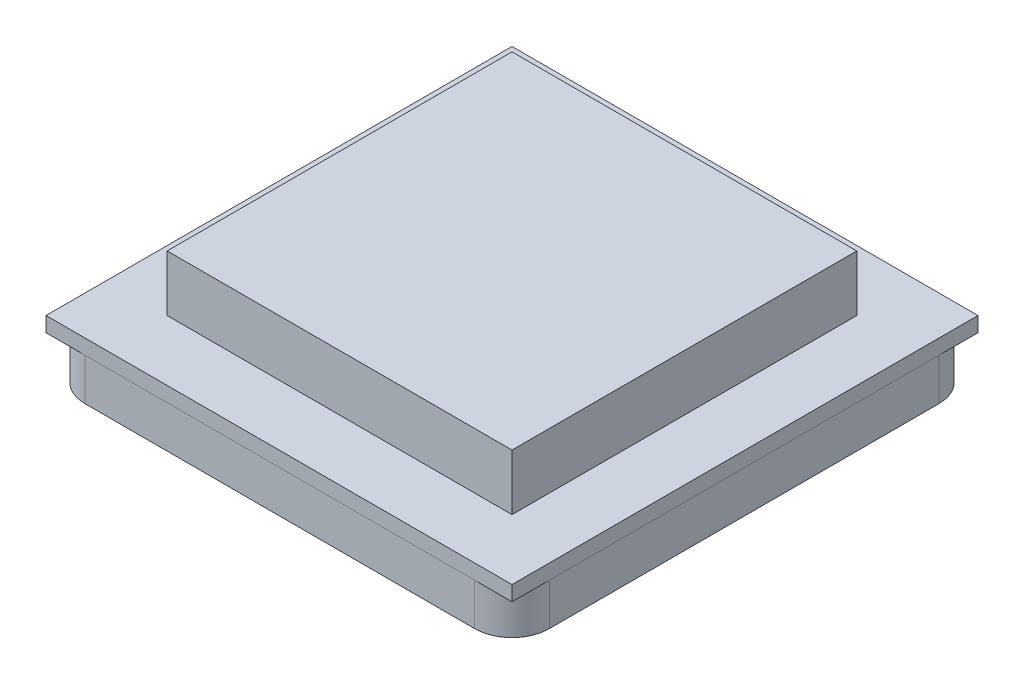
ISO-10303-21;
HEADER;
FILE_DESCRIPTION(('STEP AP214'),'2;1');
FILE_NAME('part.step','',(''),(''),'','','');
FILE_SCHEMA(('AUTOMOTIVE_DESIGN { 1 0 10303 214 1 1 1 1 }'));
ENDSEC;
DATA;
#1=APPLICATION_CONTEXT('core data for automotive mechanical design processes');
#2=APPLICATION_PROTOCOL_DEFINITION('international standard','automotive_design',2000,#1);
#3=PRODUCT_CONTEXT('',#1,'mechanical');
#4=PRODUCT('Part','Part','',(#3));
#5=PRODUCT_RELATED_PRODUCT_CATEGORY('part','',(#4));
#6=PRODUCT_DEFINITION_FORMATION('','',#4);
#7=PRODUCT_DEFINITION_CONTEXT('part definition',#1,'design');
#8=PRODUCT_DEFINITION('design','',#6,#7);
#9=PRODUCT_DEFINITION_SHAPE('','',#8);
#10=(LENGTH_UNIT() NAMED_UNIT(*) SI_UNIT(.MILLI.,.METRE.));
#11=(NAMED_UNIT(*) PLANE_ANGLE_UNIT() SI_UNIT($,.RADIAN.));
#12=(NAMED_UNIT(*) SI_UNIT($,.STERADIAN.) SOLID_ANGLE_UNIT());
#13=UNCERTAINTY_MEASURE_WITH_UNIT(LENGTH_MEASURE(1.E-05),#10,'distance_accuracy_value','');
#14=(GEOMETRIC_REPRESENTATION_CONTEXT(3) GLOBAL_UNCERTAINTY_ASSIGNED_CONTEXT((#13)) GLOBAL_UNIT_ASSIGNED_CONTEXT((#10,
#11,#12)) REPRESENTATION_CONTEXT('',''));
#15=CARTESIAN_POINT('',(0.,0.,0.));
#16=DIRECTION('',(0.,0.,1.));
#17=DIRECTION('',(1.,0.,0.));
#18=AXIS2_PLACEMENT_3D('',#15,#16,#17);
#19=CARTESIAN_POINT('',(0.,0.8,0.));
#20=DIRECTION('',(0.,-1.,0.));
#21=DIRECTION('',(0.,0.,-1.));
#22=AXIS2_PLACEMENT_3D('',#19,#20,#21);
#23=PLANE('',#22);
#24=DIRECTION('',(0.,0.,-1.));
#25=VECTOR('',#24,1.);
#26=CARTESIAN_POINT('',(12.5,0.8,12.5));
#27=LINE('',#26,#25);
#28=CARTESIAN_POINT('',(12.5,0.8,12.5));
#29=VERTEX_POINT('',#28);
#30=CARTESIAN_POINT('',(12.5,0.8,-12.5));
#31=VERTEX_POINT('',#30);
#32=EDGE_CURVE('E205',#29,#31,#27,.T.);
#33=ORIENTED_EDGE('',*,*,#32,.T.);
#34=DIRECTION('',(-1.,0.,0.));
#35=VECTOR('',#34,1.);
#36=CARTESIAN_POINT('',(-12.5,0.8,-12.5));
#37=LINE('',#36,#35);
#38=CARTESIAN_POINT('',(-12.5,0.8,-12.5));
#39=VERTEX_POINT('',#38);
#40=EDGE_CURVE('E208',#31,#39,#37,.T.);
#41=ORIENTED_EDGE('',*,*,#40,.T.);
#42=DIRECTION('',(0.,0.,1.));
#43=VECTOR('',#42,1.);
#44=CARTESIAN_POINT('',(-12.5,0.8,12.5));
#45=LINE('',#44,#43);
#46=CARTESIAN_POINT('',(-12.5,0.8,12.5));
#47=VERTEX_POINT('',#46);
#48=EDGE_CURVE('E211',#39,#47,#45,.T.);
#49=ORIENTED_EDGE('',*,*,#48,.T.);
#50=DIRECTION('',(1.,0.,0.));
#51=VECTOR('',#50,1.);
#52=CARTESIAN_POINT('',(-12.5,0.8,12.5));
#53=LINE('',#52,#51);
#54=EDGE_CURVE('E213',#47,#29,#53,.T.);
#55=ORIENTED_EDGE('',*,*,#54,.T.);
#56=EDGE_LOOP('',(#33,#41,#49,#55));
#57=FACE_BOUND('',#56,.T.);
#58=DIRECTION('',(0.,0.,-1.));
#59=VECTOR('',#58,1.);
#60=CARTESIAN_POINT('',(9.25,0.8,9.25));
#61=LINE('',#60,#59);
#62=CARTESIAN_POINT('',(9.25,0.8,9.25));
#63=VERTEX_POINT('',#62);
#64=CARTESIAN_POINT('',(9.25,0.8,-9.25));
#65=VERTEX_POINT('',#64);
#66=EDGE_CURVE('E166',#63,#65,#61,.T.);
#67=ORIENTED_EDGE('',*,*,#66,.F.);
#68=DIRECTION('',(1.,0.,0.));
#69=VECTOR('',#68,1.);
#70=CARTESIAN_POINT('',(-9.25,0.8,9.25));
#71=LINE('',#70,#69);
#72=CARTESIAN_POINT('',(-9.25,0.8,9.25));
#73=VERTEX_POINT('',#72);
#74=EDGE_CURVE('E179',#73,#63,#71,.T.);
#75=ORIENTED_EDGE('',*,*,#74,.F.);
#76=DIRECTION('',(0.,0.,1.));
#77=VECTOR('',#76,1.);
#78=CARTESIAN_POINT('',(-9.25,0.8,9.25));
#79=LINE('',#78,#77);
#80=CARTESIAN_POINT('',(-9.25,0.8,-9.25));
#81=VERTEX_POINT('',#80);
#82=EDGE_CURVE('E188',#81,#73,#79,.T.);
#83=ORIENTED_EDGE('',*,*,#82,.F.);
#84=DIRECTION('',(-1.,0.,0.));
#85=VECTOR('',#84,1.);
#86=CARTESIAN_POINT('',(-9.25,0.8,-9.25));
#87=LINE('',#86,#85);
#88=EDGE_CURVE('E169',#65,#81,#87,.T.);
#89=ORIENTED_EDGE('',*,*,#88,.F.);
#90=EDGE_LOOP('',(#67,#75,#83,#89));
#91=FACE_BOUND('',#90,.T.);
#92=ADVANCED_FACE('F33',(#57,#91),#23,.F.);
#93=CARTESIAN_POINT('',(12.5,0.8,12.5));
#94=DIRECTION('',(-1.,0.,0.));
#95=DIRECTION('',(0.,0.,1.));
#96=AXIS2_PLACEMENT_3D('',#93,#94,#95);
#97=PLANE('',#96);
#98=DIRECTION('',(0.,0.,-1.));
#99=VECTOR('',#98,1.);
#100=CARTESIAN_POINT('',(12.5,0.,12.5));
#101=LINE('',#100,#99);
#102=CARTESIAN_POINT('',(12.5,0.,12.5));
#103=VERTEX_POINT('',#102);
#104=CARTESIAN_POINT('',(12.5,0.,-12.5));
#105=VERTEX_POINT('',#104);
#106=EDGE_CURVE('E204',#103,#105,#101,.T.);
#107=ORIENTED_EDGE('',*,*,#106,.T.);
#108=DIRECTION('',(0.,-1.,0.));
#109=VECTOR('',#108,1.);
#110=CARTESIAN_POINT('',(12.5,0.8,-12.5));
#111=LINE('',#110,#109);
#112=EDGE_CURVE('E11',#31,#105,#111,.T.);
#113=ORIENTED_EDGE('',*,*,#112,.F.);
#114=ORIENTED_EDGE('',*,*,#32,.F.);
#115=DIRECTION('',(0.,-1.,0.));
#116=VECTOR('',#115,1.);
#117=CARTESIAN_POINT('',(12.5,0.8,12.5));
#118=LINE('',#117,#116);
#119=EDGE_CURVE('E215',#29,#103,#118,.T.);
#120=ORIENTED_EDGE('',*,*,#119,.T.);
#121=EDGE_LOOP('',(#107,#113,#114,#120));
#122=FACE_BOUND('',#121,.T.);
#123=ADVANCED_FACE('F35',(#122),#97,.F.);
#124=CARTESIAN_POINT('',(-12.5,0.8,-12.5));
#125=DIRECTION('',(0.,0.,1.));
#126=DIRECTION('',(1.,0.,0.));
#127=AXIS2_PLACEMENT_3D('',#124,#125,#126);
#128=PLANE('',#127);
#129=DIRECTION('',(-1.,0.,0.));
#130=VECTOR('',#129,1.);
#131=CARTESIAN_POINT('',(-12.5,0.,-12.5));
#132=LINE('',#131,#130);
#133=CARTESIAN_POINT('',(-12.5,0.,-12.5));
#134=VERTEX_POINT('',#133);
#135=EDGE_CURVE('E218',#105,#134,#132,.T.);
#136=ORIENTED_EDGE('',*,*,#135,.T.);
#137=DIRECTION('',(0.,-1.,0.));
#138=VECTOR('',#137,1.);
#139=CARTESIAN_POINT('',(-12.5,0.8,-12.5));
#140=LINE('',#139,#138);
#141=EDGE_CURVE('E41',#39,#134,#140,.T.);
#142=ORIENTED_EDGE('',*,*,#141,.F.);
#143=ORIENTED_EDGE('',*,*,#40,.F.);
#144=ORIENTED_EDGE('',*,*,#112,.T.);
#145=EDGE_LOOP('',(#136,#142,#143,#144));
#146=FACE_BOUND('',#145,.T.);
#147=ADVANCED_FACE('F248',(#146),#128,.F.);
#148=CARTESIAN_POINT('',(-12.5,0.8,12.5));
#149=DIRECTION('',(1.,0.,0.));
#150=DIRECTION('',(0.,0.,-1.));
#151=AXIS2_PLACEMENT_3D('',#148,#149,#150);
#152=PLANE('',#151);
#153=DIRECTION('',(0.,0.,1.));
#154=VECTOR('',#153,1.);
#155=CARTESIAN_POINT('',(-12.5,0.,12.5));
#156=LINE('',#155,#154);
#157=CARTESIAN_POINT('',(-12.5,0.,12.5));
#158=VERTEX_POINT('',#157);
#159=EDGE_CURVE('E220',#134,#158,#156,.T.);
#160=ORIENTED_EDGE('',*,*,#159,.T.);
#161=DIRECTION('',(0.,-1.,0.));
#162=VECTOR('',#161,1.);
#163=CARTESIAN_POINT('',(-12.5,0.8,12.5));
#164=LINE('',#163,#162);
#165=EDGE_CURVE('E225',#47,#158,#164,.T.);
#166=ORIENTED_EDGE('',*,*,#165,.F.);
#167=ORIENTED_EDGE('',*,*,#48,.F.);
#168=ORIENTED_EDGE('',*,*,#141,.T.);
#169=EDGE_LOOP('',(#160,#166,#167,#168));
#170=FACE_BOUND('',#169,.T.);
#171=ADVANCED_FACE('F232',(#170),#152,.F.);
#172=CARTESIAN_POINT('',(-12.5,0.8,12.5));
#173=DIRECTION('',(0.,0.,-1.));
#174=DIRECTION('',(-1.,0.,0.));
#175=AXIS2_PLACEMENT_3D('',#172,#173,#174);
#176=PLANE('',#175);
#177=DIRECTION('',(1.,0.,0.));
#178=VECTOR('',#177,1.);
#179=CARTESIAN_POINT('',(-12.5,0.,12.5));
#180=LINE('',#179,#178);
#181=EDGE_CURVE('E209',#158,#103,#180,.T.);
#182=ORIENTED_EDGE('',*,*,#181,.T.);
#183=ORIENTED_EDGE('',*,*,#119,.F.);
#184=ORIENTED_EDGE('',*,*,#54,.F.);
#185=ORIENTED_EDGE('',*,*,#165,.T.);
#186=EDGE_LOOP('',(#182,#183,#184,#185));
#187=FACE_BOUND('',#186,.T.);
#188=ADVANCED_FACE('F241',(#187),#176,.F.);
#189=CARTESIAN_POINT('',(0.,0.,0.));
#190=DIRECTION('',(0.,-1.,0.));
#191=DIRECTION('',(0.,0.,-1.));
#192=AXIS2_PLACEMENT_3D('',#189,#190,#191);
#193=PLANE('',#192);
#194=CARTESIAN_POINT('',(-10.45,0.,-10.45));
#195=DIRECTION('',(0.,-1.,0.));
#196=DIRECTION('',(0.,0.,1.));
#197=AXIS2_PLACEMENT_3D('',#194,#195,#196);
#198=CIRCLE('',#197,2.);
#199=CARTESIAN_POINT('',(-12.45,0.,-10.45));
#200=VERTEX_POINT('',#199);
#201=CARTESIAN_POINT('',(-10.45,0.,-12.45));
#202=VERTEX_POINT('',#201);
#203=EDGE_CURVE('E48',#200,#202,#198,.T.);
#204=ORIENTED_EDGE('',*,*,#203,.F.);
#205=DIRECTION('',(0.,0.,-1.));
#206=VECTOR('',#205,1.);
#207=CARTESIAN_POINT('',(-12.45,0.,-10.45));
#208=LINE('',#207,#206);
#209=CARTESIAN_POINT('',(-12.45,0.,10.45));
#210=VERTEX_POINT('',#209);
#211=EDGE_CURVE('E52',#210,#200,#208,.T.);
#212=ORIENTED_EDGE('',*,*,#211,.F.);
#213=CARTESIAN_POINT('',(-10.45,0.,10.45));
#214=DIRECTION('',(0.,-1.,0.));
#215=DIRECTION('',(0.,0.,1.));
#216=AXIS2_PLACEMENT_3D('',#213,#214,#215);
#217=CIRCLE('',#216,2.);
#218=CARTESIAN_POINT('',(-10.45,0.,12.45));
#219=VERTEX_POINT('',#218);
#220=EDGE_CURVE('E433',#219,#210,#217,.T.);
#221=ORIENTED_EDGE('',*,*,#220,.F.);
#222=DIRECTION('',(-1.,0.,0.));
#223=VECTOR('',#222,1.);
#224=CARTESIAN_POINT('',(-10.45,0.,12.45));
#225=LINE('',#224,#223);
#226=CARTESIAN_POINT('',(10.45,0.,12.45));
#227=VERTEX_POINT('',#226);
#228=EDGE_CURVE('E467',#227,#219,#225,.T.);
#229=ORIENTED_EDGE('',*,*,#228,.F.);
#230=CARTESIAN_POINT('',(10.45,0.,10.45));
#231=DIRECTION('',(0.,-1.,0.));
#232=DIRECTION('',(0.,0.,1.));
#233=AXIS2_PLACEMENT_3D('',#230,#231,#232);
#234=CIRCLE('',#233,2.);
#235=CARTESIAN_POINT('',(12.45,0.,10.45));
#236=VERTEX_POINT('',#235);
#237=EDGE_CURVE('E460',#236,#227,#234,.T.);
#238=ORIENTED_EDGE('',*,*,#237,.F.);
#239=DIRECTION('',(0.,0.,1.));
#240=VECTOR('',#239,1.);
#241=CARTESIAN_POINT('',(12.45,0.,-10.45));
#242=LINE('',#241,#240);
#243=CARTESIAN_POINT('',(12.45,0.,-10.45));
#244=VERTEX_POINT('',#243);
#245=EDGE_CURVE('E454',#244,#236,#242,.T.);
#246=ORIENTED_EDGE('',*,*,#245,.F.);
#247=CARTESIAN_POINT('',(10.45,0.,-10.45));
#248=DIRECTION('',(0.,-1.,0.));
#249=DIRECTION('',(0.,0.,-1.));
#250=AXIS2_PLACEMENT_3D('',#247,#248,#249);
#251=CIRCLE('',#250,2.);
#252=CARTESIAN_POINT('',(10.45,0.,-12.45));
#253=VERTEX_POINT('',#252);
#254=EDGE_CURVE('E457',#253,#244,#251,.T.);
#255=ORIENTED_EDGE('',*,*,#254,.F.);
#256=DIRECTION('',(1.,0.,0.));
#257=VECTOR('',#256,1.);
#258=CARTESIAN_POINT('',(-10.45,0.,-12.45));
#259=LINE('',#258,#257);
#260=EDGE_CURVE('E458',#202,#253,#259,.T.);
#261=ORIENTED_EDGE('',*,*,#260,.F.);
#262=EDGE_LOOP('',(#204,#212,#221,#229,#238,#246,#255,#261));
#263=FACE_BOUND('',#262,.T.);
#264=ORIENTED_EDGE('',*,*,#106,.F.);
#265=ORIENTED_EDGE('',*,*,#181,.F.);
#266=ORIENTED_EDGE('',*,*,#159,.F.);
#267=ORIENTED_EDGE('',*,*,#135,.F.);
#268=EDGE_LOOP('',(#264,#265,#266,#267));
#269=FACE_BOUND('',#268,.T.);
#270=ADVANCED_FACE('F238',(#263,#269),#193,.T.);
#271=CARTESIAN_POINT('',(9.25,3.8,9.25));
#272=DIRECTION('',(-1.,0.,0.));
#273=DIRECTION('',(0.,0.,1.));
#274=AXIS2_PLACEMENT_3D('',#271,#272,#273);
#275=PLANE('',#274);
#276=ORIENTED_EDGE('',*,*,#66,.T.);
#277=DIRECTION('',(0.,-1.,0.));
#278=VECTOR('',#277,1.);
#279=CARTESIAN_POINT('',(9.25,3.8,-9.25));
#280=LINE('',#279,#278);
#281=CARTESIAN_POINT('',(9.25,3.8,-9.25));
#282=VERTEX_POINT('',#281);
#283=EDGE_CURVE('E201',#282,#65,#280,.T.);
#284=ORIENTED_EDGE('',*,*,#283,.F.);
#285=DIRECTION('',(0.,0.,-1.));
#286=VECTOR('',#285,1.);
#287=CARTESIAN_POINT('',(9.25,3.8,9.25));
#288=LINE('',#287,#286);
#289=CARTESIAN_POINT('',(9.25,3.8,9.25));
#290=VERTEX_POINT('',#289);
#291=EDGE_CURVE('E175',#290,#282,#288,.T.);
#292=ORIENTED_EDGE('',*,*,#291,.F.);
#293=DIRECTION('',(0.,-1.,0.));
#294=VECTOR('',#293,1.);
#295=CARTESIAN_POINT('',(9.25,3.8,9.25));
#296=LINE('',#295,#294);
#297=EDGE_CURVE('E184',#290,#63,#296,.T.);
#298=ORIENTED_EDGE('',*,*,#297,.T.);
#299=EDGE_LOOP('',(#276,#284,#292,#298));
#300=FACE_BOUND('',#299,.T.);
#301=ADVANCED_FACE('F261',(#300),#275,.F.);
#302=CARTESIAN_POINT('',(-9.25,3.8,-9.25));
#303=DIRECTION('',(0.,0.,1.));
#304=DIRECTION('',(1.,0.,0.));
#305=AXIS2_PLACEMENT_3D('',#302,#303,#304);
#306=PLANE('',#305);
#307=ORIENTED_EDGE('',*,*,#88,.T.);
#308=DIRECTION('',(0.,-1.,0.));
#309=VECTOR('',#308,1.);
#310=CARTESIAN_POINT('',(-9.25,3.8,-9.25));
#311=LINE('',#310,#309);
#312=CARTESIAN_POINT('',(-9.25,3.8,-9.25));
#313=VERTEX_POINT('',#312);
#314=EDGE_CURVE('E198',#313,#81,#311,.T.);
#315=ORIENTED_EDGE('',*,*,#314,.F.);
#316=DIRECTION('',(-1.,0.,0.));
#317=VECTOR('',#316,1.);
#318=CARTESIAN_POINT('',(-9.25,3.8,-9.25));
#319=LINE('',#318,#317);
#320=EDGE_CURVE('E178',#282,#313,#319,.T.);
#321=ORIENTED_EDGE('',*,*,#320,.F.);
#322=ORIENTED_EDGE('',*,*,#283,.T.);
#323=EDGE_LOOP('',(#307,#315,#321,#322));
#324=FACE_BOUND('',#323,.T.);
#325=ADVANCED_FACE('F282',(#324),#306,.F.);
#326=CARTESIAN_POINT('',(-9.25,3.8,9.25));
#327=DIRECTION('',(1.,0.,0.));
#328=DIRECTION('',(0.,0.,-1.));
#329=AXIS2_PLACEMENT_3D('',#326,#327,#328);
#330=PLANE('',#329);
#331=ORIENTED_EDGE('',*,*,#82,.T.);
#332=DIRECTION('',(0.,-1.,0.));
#333=VECTOR('',#332,1.);
#334=CARTESIAN_POINT('',(-9.25,3.8,9.25));
#335=LINE('',#334,#333);
#336=CARTESIAN_POINT('',(-9.25,3.8,9.25));
#337=VERTEX_POINT('',#336);
#338=EDGE_CURVE('E195',#337,#73,#335,.T.);
#339=ORIENTED_EDGE('',*,*,#338,.F.);
#340=DIRECTION('',(0.,0.,1.));
#341=VECTOR('',#340,1.);
#342=CARTESIAN_POINT('',(-9.25,3.8,9.25));
#343=LINE('',#342,#341);
#344=EDGE_CURVE('E181',#313,#337,#343,.T.);
#345=ORIENTED_EDGE('',*,*,#344,.F.);
#346=ORIENTED_EDGE('',*,*,#314,.T.);
#347=EDGE_LOOP('',(#331,#339,#345,#346));
#348=FACE_BOUND('',#347,.T.);
#349=ADVANCED_FACE('F289',(#348),#330,.F.);
#350=CARTESIAN_POINT('',(-9.25,3.8,9.25));
#351=DIRECTION('',(0.,0.,-1.));
#352=DIRECTION('',(-1.,0.,0.));
#353=AXIS2_PLACEMENT_3D('',#350,#351,#352);
#354=PLANE('',#353);
#355=ORIENTED_EDGE('',*,*,#74,.T.);
#356=ORIENTED_EDGE('',*,*,#297,.F.);
#357=DIRECTION('',(1.,0.,0.));
#358=VECTOR('',#357,1.);
#359=CARTESIAN_POINT('',(-9.25,3.8,9.25));
#360=LINE('',#359,#358);
#361=EDGE_CURVE('E183',#337,#290,#360,.T.);
#362=ORIENTED_EDGE('',*,*,#361,.F.);
#363=ORIENTED_EDGE('',*,*,#338,.T.);
#364=EDGE_LOOP('',(#355,#356,#362,#363));
#365=FACE_BOUND('',#364,.T.);
#366=ADVANCED_FACE('F296',(#365),#354,.F.);
#367=CARTESIAN_POINT('',(0.,3.8,0.));
#368=DIRECTION('',(0.,-1.,0.));
#369=DIRECTION('',(0.,0.,-1.));
#370=AXIS2_PLACEMENT_3D('',#367,#368,#369);
#371=PLANE('',#370);
#372=ORIENTED_EDGE('',*,*,#291,.T.);
#373=ORIENTED_EDGE('',*,*,#320,.T.);
#374=ORIENTED_EDGE('',*,*,#344,.T.);
#375=ORIENTED_EDGE('',*,*,#361,.T.);
#376=EDGE_LOOP('',(#372,#373,#374,#375));
#377=FACE_BOUND('',#376,.T.);
#378=ADVANCED_FACE('F304',(#377),#371,.F.);
#379=CARTESIAN_POINT('',(-10.45,-2.3,-10.45));
#380=DIRECTION('',(0.,1.,0.));
#381=DIRECTION('',(0.,0.,1.));
#382=AXIS2_PLACEMENT_3D('',#379,#380,#381);
#383=CYLINDRICAL_SURFACE('',#382,2.);
#384=ORIENTED_EDGE('',*,*,#203,.T.);
#385=DIRECTION('',(0.,1.,0.));
#386=VECTOR('',#385,1.);
#387=CARTESIAN_POINT('',(-10.45,-2.3,-12.45));
#388=LINE('',#387,#386);
#389=CARTESIAN_POINT('',(-10.45,-2.3,-12.45));
#390=VERTEX_POINT('',#389);
#391=EDGE_CURVE('E149',#390,#202,#388,.T.);
#392=ORIENTED_EDGE('',*,*,#391,.F.);
#393=CARTESIAN_POINT('',(-10.45,-2.3,-10.45));
#394=DIRECTION('',(0.,-1.,0.));
#395=DIRECTION('',(0.,0.,1.));
#396=AXIS2_PLACEMENT_3D('',#393,#394,#395);
#397=CIRCLE('',#396,2.);
#398=CARTESIAN_POINT('',(-12.45,-2.3,-10.45));
#399=VERTEX_POINT('',#398);
#400=EDGE_CURVE('E155',#399,#390,#397,.T.);
#401=ORIENTED_EDGE('',*,*,#400,.F.);
#402=DIRECTION('',(0.,1.,0.));
#403=VECTOR('',#402,1.);
#404=CARTESIAN_POINT('',(-12.45,-2.3,-10.45));
#405=LINE('',#404,#403);
#406=EDGE_CURVE('E430',#399,#200,#405,.T.);
#407=ORIENTED_EDGE('',*,*,#406,.T.);
#408=EDGE_LOOP('',(#384,#392,#401,#407));
#409=FACE_BOUND('',#408,.T.);
#410=ADVANCED_FACE('F165',(#409),#383,.T.);
#411=CARTESIAN_POINT('',(-10.45,-2.3,-12.45));
#412=DIRECTION('',(0.,0.,1.));
#413=DIRECTION('',(1.,0.,0.));
#414=AXIS2_PLACEMENT_3D('',#411,#412,#413);
#415=PLANE('',#414);
#416=ORIENTED_EDGE('',*,*,#260,.T.);
#417=DIRECTION('',(0.,1.,0.));
#418=VECTOR('',#417,1.);
#419=CARTESIAN_POINT('',(10.45,-2.3,-12.45));
#420=LINE('',#419,#418);
#421=CARTESIAN_POINT('',(10.45,-2.3,-12.45));
#422=VERTEX_POINT('',#421);
#423=EDGE_CURVE('E151',#422,#253,#420,.T.);
#424=ORIENTED_EDGE('',*,*,#423,.F.);
#425=DIRECTION('',(1.,0.,0.));
#426=VECTOR('',#425,1.);
#427=CARTESIAN_POINT('',(-10.45,-2.3,-12.45));
#428=LINE('',#427,#426);
#429=EDGE_CURVE('E144',#390,#422,#428,.T.);
#430=ORIENTED_EDGE('',*,*,#429,.F.);
#431=ORIENTED_EDGE('',*,*,#391,.T.);
#432=EDGE_LOOP('',(#416,#424,#430,#431));
#433=FACE_BOUND('',#432,.T.);
#434=ADVANCED_FACE('F147',(#433),#415,.F.);
#435=CARTESIAN_POINT('',(10.45,-2.3,-10.45));
#436=DIRECTION('',(0.,1.,0.));
#437=DIRECTION('',(0.,0.,1.));
#438=AXIS2_PLACEMENT_3D('',#435,#436,#437);
#439=CYLINDRICAL_SURFACE('',#438,2.);
#440=ORIENTED_EDGE('',*,*,#254,.T.);
#441=DIRECTION('',(0.,1.,0.));
#442=VECTOR('',#441,1.);
#443=CARTESIAN_POINT('',(12.45,-2.3,-10.45));
#444=LINE('',#443,#442);
#445=CARTESIAN_POINT('',(12.45,-2.3,-10.45));
#446=VERTEX_POINT('',#445);
#447=EDGE_CURVE('E171',#446,#244,#444,.T.);
#448=ORIENTED_EDGE('',*,*,#447,.F.);
#449=CARTESIAN_POINT('',(10.45,-2.3,-10.45));
#450=DIRECTION('',(0.,-1.,0.));
#451=DIRECTION('',(0.,0.,-1.));
#452=AXIS2_PLACEMENT_3D('',#449,#450,#451);
#453=CIRCLE('',#452,2.);
#454=EDGE_CURVE('E154',#422,#446,#453,.T.);
#455=ORIENTED_EDGE('',*,*,#454,.F.);
#456=ORIENTED_EDGE('',*,*,#423,.T.);
#457=EDGE_LOOP('',(#440,#448,#455,#456));
#458=FACE_BOUND('',#457,.T.);
#459=ADVANCED_FACE('F323',(#458),#439,.T.);
#460=CARTESIAN_POINT('',(12.45,-2.3,-10.45));
#461=DIRECTION('',(-1.,0.,0.));
#462=DIRECTION('',(0.,0.,1.));
#463=AXIS2_PLACEMENT_3D('',#460,#461,#462);
#464=PLANE('',#463);
#465=ORIENTED_EDGE('',*,*,#245,.T.);
#466=DIRECTION('',(0.,1.,0.));
#467=VECTOR('',#466,1.);
#468=CARTESIAN_POINT('',(12.45,-2.3,10.45));
#469=LINE('',#468,#467);
#470=CARTESIAN_POINT('',(12.45,-2.3,10.45));
#471=VERTEX_POINT('',#470);
#472=EDGE_CURVE('E447',#471,#236,#469,.T.);
#473=ORIENTED_EDGE('',*,*,#472,.F.);
#474=DIRECTION('',(0.,0.,1.));
#475=VECTOR('',#474,1.);
#476=CARTESIAN_POINT('',(12.45,-2.3,-10.45));
#477=LINE('',#476,#475);
#478=EDGE_CURVE('E455',#446,#471,#477,.T.);
#479=ORIENTED_EDGE('',*,*,#478,.F.);
#480=ORIENTED_EDGE('',*,*,#447,.T.);
#481=EDGE_LOOP('',(#465,#473,#479,#480));
#482=FACE_BOUND('',#481,.T.);
#483=ADVANCED_FACE('F330',(#482),#464,.F.);
#484=CARTESIAN_POINT('',(10.45,-2.3,10.45));
#485=DIRECTION('',(0.,1.,0.));
#486=DIRECTION('',(0.,0.,1.));
#487=AXIS2_PLACEMENT_3D('',#484,#485,#486);
#488=CYLINDRICAL_SURFACE('',#487,2.);
#489=ORIENTED_EDGE('',*,*,#237,.T.);
#490=DIRECTION('',(0.,1.,0.));
#491=VECTOR('',#490,1.);
#492=CARTESIAN_POINT('',(10.45,-2.3,12.45));
#493=LINE('',#492,#491);
#494=CARTESIAN_POINT('',(10.45,-2.3,12.45));
#495=VERTEX_POINT('',#494);
#496=EDGE_CURVE('E444',#495,#227,#493,.T.);
#497=ORIENTED_EDGE('',*,*,#496,.F.);
#498=CARTESIAN_POINT('',(10.45,-2.3,10.45));
#499=DIRECTION('',(0.,-1.,0.));
#500=DIRECTION('',(0.,0.,1.));
#501=AXIS2_PLACEMENT_3D('',#498,#499,#500);
#502=CIRCLE('',#501,2.);
#503=EDGE_CURVE('E475',#471,#495,#502,.T.);
#504=ORIENTED_EDGE('',*,*,#503,.F.);
#505=ORIENTED_EDGE('',*,*,#472,.T.);
#506=EDGE_LOOP('',(#489,#497,#504,#505));
#507=FACE_BOUND('',#506,.T.);
#508=ADVANCED_FACE('F338',(#507),#488,.T.);
#509=CARTESIAN_POINT('',(-10.45,-2.3,12.45));
#510=DIRECTION('',(0.,0.,-1.));
#511=DIRECTION('',(-1.,0.,0.));
#512=AXIS2_PLACEMENT_3D('',#509,#510,#511);
#513=PLANE('',#512);
#514=ORIENTED_EDGE('',*,*,#228,.T.);
#515=DIRECTION('',(0.,1.,0.));
#516=VECTOR('',#515,1.);
#517=CARTESIAN_POINT('',(-10.45,-2.3,12.45));
#518=LINE('',#517,#516);
#519=CARTESIAN_POINT('',(-10.45,-2.3,12.45));
#520=VERTEX_POINT('',#519);
#521=EDGE_CURVE('E436',#520,#219,#518,.T.);
#522=ORIENTED_EDGE('',*,*,#521,.F.);
#523=DIRECTION('',(-1.,0.,0.));
#524=VECTOR('',#523,1.);
#525=CARTESIAN_POINT('',(-10.45,-2.3,12.45));
#526=LINE('',#525,#524);
#527=EDGE_CURVE('E473',#495,#520,#526,.T.);
#528=ORIENTED_EDGE('',*,*,#527,.F.);
#529=ORIENTED_EDGE('',*,*,#496,.T.);
#530=EDGE_LOOP('',(#514,#522,#528,#529));
#531=FACE_BOUND('',#530,.T.);
#532=ADVANCED_FACE('F346',(#531),#513,.F.);
#533=CARTESIAN_POINT('',(-10.45,-2.3,10.45));
#534=DIRECTION('',(0.,1.,0.));
#535=DIRECTION('',(0.,0.,1.));
#536=AXIS2_PLACEMENT_3D('',#533,#534,#535);
#537=CYLINDRICAL_SURFACE('',#536,2.);
#538=ORIENTED_EDGE('',*,*,#220,.T.);
#539=DIRECTION('',(0.,1.,0.));
#540=VECTOR('',#539,1.);
#541=CARTESIAN_POINT('',(-12.45,-2.3,10.45));
#542=LINE('',#541,#540);
#543=CARTESIAN_POINT('',(-12.45,-2.3,10.45));
#544=VERTEX_POINT('',#543);
#545=EDGE_CURVE('E432',#544,#210,#542,.T.);
#546=ORIENTED_EDGE('',*,*,#545,.F.);
#547=CARTESIAN_POINT('',(-10.45,-2.3,10.45));
#548=DIRECTION('',(0.,-1.,0.));
#549=DIRECTION('',(0.,0.,1.));
#550=AXIS2_PLACEMENT_3D('',#547,#548,#549);
#551=CIRCLE('',#550,2.);
#552=EDGE_CURVE('E438',#520,#544,#551,.T.);
#553=ORIENTED_EDGE('',*,*,#552,.F.);
#554=ORIENTED_EDGE('',*,*,#521,.T.);
#555=EDGE_LOOP('',(#538,#546,#553,#554));
#556=FACE_BOUND('',#555,.T.);
#557=ADVANCED_FACE('F354',(#556),#537,.T.);
#558=CARTESIAN_POINT('',(-12.45,-2.3,-10.45));
#559=DIRECTION('',(1.,0.,0.));
#560=DIRECTION('',(0.,0.,-1.));
#561=AXIS2_PLACEMENT_3D('',#558,#559,#560);
#562=PLANE('',#561);
#563=ORIENTED_EDGE('',*,*,#211,.T.);
#564=ORIENTED_EDGE('',*,*,#406,.F.);
#565=DIRECTION('',(0.,0.,-1.));
#566=VECTOR('',#565,1.);
#567=CARTESIAN_POINT('',(-12.45,-2.3,-10.45));
#568=LINE('',#567,#566);
#569=EDGE_CURVE('E160',#544,#399,#568,.T.);
#570=ORIENTED_EDGE('',*,*,#569,.F.);
#571=ORIENTED_EDGE('',*,*,#545,.T.);
#572=EDGE_LOOP('',(#563,#564,#570,#571));
#573=FACE_BOUND('',#572,.T.);
#574=ADVANCED_FACE('F362',(#573),#562,.F.);
#575=CARTESIAN_POINT('',(-10.45,-2.3,-10.45));
#576=DIRECTION('',(0.,1.,0.));
#577=DIRECTION('',(0.,0.,1.));
#578=AXIS2_PLACEMENT_3D('',#575,#576,#577);
#579=PLANE('',#578);
#580=ORIENTED_EDGE('',*,*,#400,.T.);
#581=ORIENTED_EDGE('',*,*,#429,.T.);
#582=ORIENTED_EDGE('',*,*,#454,.T.);
#583=ORIENTED_EDGE('',*,*,#478,.T.);
#584=ORIENTED_EDGE('',*,*,#503,.T.);
#585=ORIENTED_EDGE('',*,*,#527,.T.);
#586=ORIENTED_EDGE('',*,*,#552,.T.);
#587=ORIENTED_EDGE('',*,*,#569,.T.);
#588=EDGE_LOOP('',(#580,#581,#582,#583,#584,#585,#586,#587));
#589=FACE_BOUND('',#588,.T.);
#590=ADVANCED_FACE('F158',(#589),#579,.F.);
#591=CLOSED_SHELL('',(#92,#123,#147,#171,#188,#270,#301,#325,#349,#366,#378,#410,#434,#459,#483,
#508,#532,#557,#574,#590));
#592=MANIFOLD_SOLID_BREP('B2',#591);
#593=ADVANCED_BREP_SHAPE_REPRESENTATION('',(#18,#592),#14);
#594=SHAPE_DEFINITION_REPRESENTATION(#9,#593);
ENDSEC;
END-ISO-10303-21;
